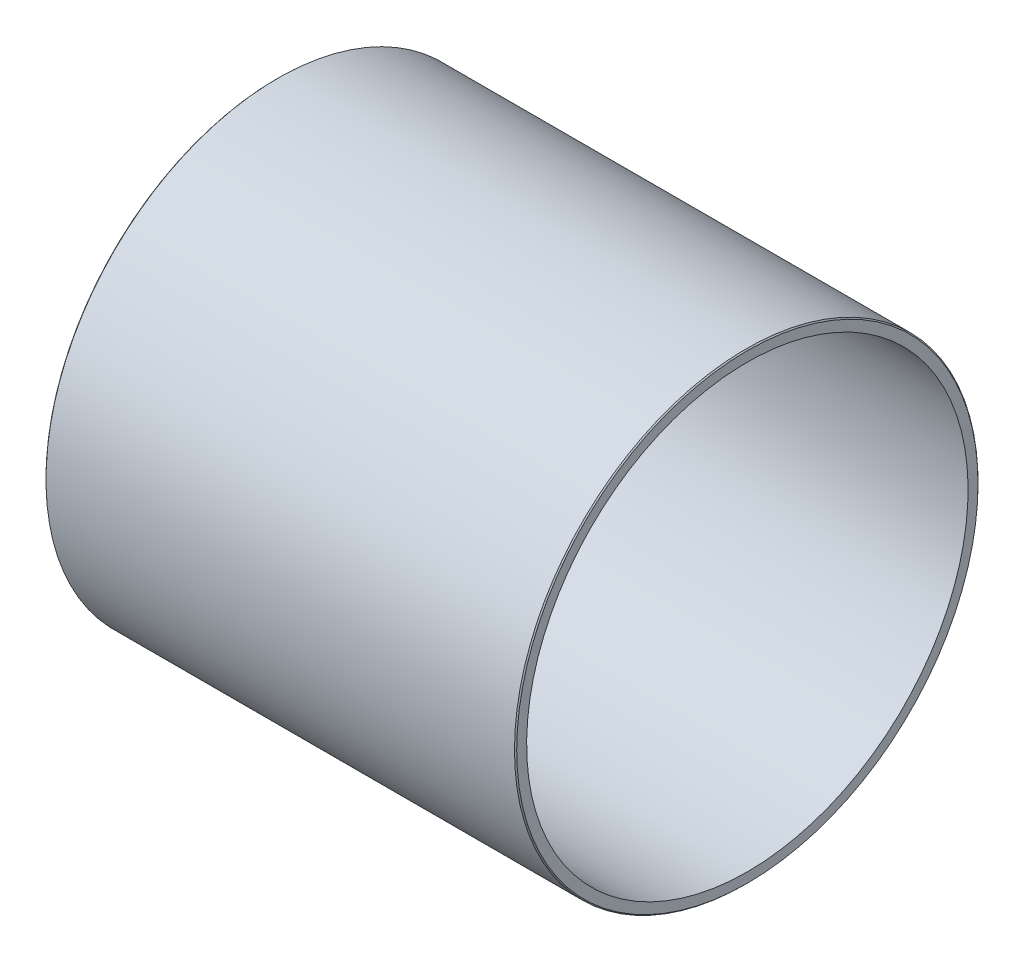
ISO-10303-21;
HEADER;
FILE_DESCRIPTION(('STEP AP214'),'2;1');
FILE_NAME('part.step','',(''),(''),'','','');
FILE_SCHEMA(('AUTOMOTIVE_DESIGN { 1 0 10303 214 1 1 1 1 }'));
ENDSEC;
DATA;
#1=APPLICATION_CONTEXT('core data for automotive mechanical design processes');
#2=APPLICATION_PROTOCOL_DEFINITION('international standard','automotive_design',2000,#1);
#3=PRODUCT_CONTEXT('',#1,'mechanical');
#4=PRODUCT('Part','Part','',(#3));
#5=PRODUCT_RELATED_PRODUCT_CATEGORY('part','',(#4));
#6=PRODUCT_DEFINITION_FORMATION('','',#4);
#7=PRODUCT_DEFINITION_CONTEXT('part definition',#1,'design');
#8=PRODUCT_DEFINITION('design','',#6,#7);
#9=PRODUCT_DEFINITION_SHAPE('','',#8);
#10=(LENGTH_UNIT() NAMED_UNIT(*) SI_UNIT(.MILLI.,.METRE.));
#11=(NAMED_UNIT(*) PLANE_ANGLE_UNIT() SI_UNIT($,.RADIAN.));
#12=(NAMED_UNIT(*) SI_UNIT($,.STERADIAN.) SOLID_ANGLE_UNIT());
#13=UNCERTAINTY_MEASURE_WITH_UNIT(LENGTH_MEASURE(1.E-05),#10,'distance_accuracy_value','');
#14=(GEOMETRIC_REPRESENTATION_CONTEXT(3) GLOBAL_UNCERTAINTY_ASSIGNED_CONTEXT((#13)) GLOBAL_UNIT_ASSIGNED_CONTEXT((#10,
#11,#12)) REPRESENTATION_CONTEXT('',''));
#15=CARTESIAN_POINT('',(0.,0.,0.));
#16=DIRECTION('',(0.,0.,1.));
#17=DIRECTION('',(1.,0.,0.));
#18=AXIS2_PLACEMENT_3D('',#15,#16,#17);
#19=CARTESIAN_POINT('',(9.2,20.5,0.));
#20=DIRECTION('',(-1.,0.,0.));
#21=DIRECTION('',(0.,0.,1.));
#22=AXIS2_PLACEMENT_3D('',#19,#20,#21);
#23=PLANE('',#22);
#24=CARTESIAN_POINT('',(9.2,0.,0.));
#25=DIRECTION('',(1.,0.,0.));
#26=DIRECTION('',(0.,-1.,0.));
#27=AXIS2_PLACEMENT_3D('',#24,#25,#26);
#28=CIRCLE('',#27,20.);
#29=CARTESIAN_POINT('',(9.2,-20.,0.));
#30=VERTEX_POINT('',#29);
#31=EDGE_CURVE('E89',#30,#30,#28,.T.);
#32=ORIENTED_EDGE('',*,*,#31,.T.);
#33=EDGE_LOOP('',(#32));
#34=FACE_BOUND('',#33,.T.);
#35=CARTESIAN_POINT('',(9.2,0.,0.));
#36=DIRECTION('',(-1.,0.,0.));
#37=DIRECTION('',(0.,0.,-1.));
#38=AXIS2_PLACEMENT_3D('',#35,#36,#37);
#39=CIRCLE('',#38,20.9);
#40=CARTESIAN_POINT('',(9.2,0.,-20.9));
#41=VERTEX_POINT('',#40);
#42=EDGE_CURVE('E11',#41,#41,#39,.T.);
#43=ORIENTED_EDGE('',*,*,#42,.T.);
#44=EDGE_LOOP('',(#43));
#45=FACE_BOUND('',#44,.T.);
#46=ADVANCED_FACE('F17',(#34,#45),#23,.T.);
#47=CARTESIAN_POINT('',(9.25,0.,0.));
#48=DIRECTION('',(1.,0.,0.));
#49=DIRECTION('',(0.,0.,1.));
#50=AXIS2_PLACEMENT_3D('',#47,#48,#49);
#51=CONICAL_SURFACE('',#50,20.95,0.785398163397448);
#52=CARTESIAN_POINT('',(9.3,0.,0.));
#53=DIRECTION('',(-1.,0.,0.));
#54=DIRECTION('',(0.,0.,-1.));
#55=AXIS2_PLACEMENT_3D('',#52,#53,#54);
#56=CIRCLE('',#55,21.);
#57=CARTESIAN_POINT('',(9.3,0.,-21.));
#58=VERTEX_POINT('',#57);
#59=CARTESIAN_POINT('',(9.3,-21.,0.));
#60=VERTEX_POINT('',#59);
#61=EDGE_CURVE('E79',#58,#60,#56,.T.);
#62=ORIENTED_EDGE('',*,*,#61,.T.);
#63=CARTESIAN_POINT('',(9.3,0.,0.));
#64=DIRECTION('',(-1.,0.,0.));
#65=DIRECTION('',(0.,0.,-1.));
#66=AXIS2_PLACEMENT_3D('',#63,#64,#65);
#67=CIRCLE('',#66,21.);
#68=EDGE_CURVE('E69',#60,#58,#67,.T.);
#69=ORIENTED_EDGE('',*,*,#68,.T.);
#70=DIRECTION('',(-0.707106781186548,0.,0.707106781186548));
#71=VECTOR('',#70,1.);
#72=CARTESIAN_POINT('',(9.25,0.,-20.95));
#73=LINE('',#72,#71);
#74=EDGE_CURVE('E28',#58,#41,#73,.T.);
#75=ORIENTED_EDGE('',*,*,#74,.T.);
#76=ORIENTED_EDGE('',*,*,#42,.F.);
#77=ORIENTED_EDGE('',*,*,#74,.F.);
#78=EDGE_LOOP('',(#62,#69,#75,#76,#77));
#79=FACE_BOUND('',#78,.T.);
#80=ADVANCED_FACE('F100',(#79),#51,.T.);
#81=CARTESIAN_POINT('',(30.525,0.,0.));
#82=DIRECTION('',(-1.,0.,0.));
#83=DIRECTION('',(0.,1.,0.));
#84=AXIS2_PLACEMENT_3D('',#81,#82,#83);
#85=CYLINDRICAL_SURFACE('',#84,21.);
#86=ORIENTED_EDGE('',*,*,#61,.F.);
#87=ORIENTED_EDGE('',*,*,#68,.F.);
#88=DIRECTION('',(1.,0.,0.));
#89=VECTOR('',#88,1.);
#90=CARTESIAN_POINT('',(30.525,-21.,0.));
#91=LINE('',#90,#89);
#92=CARTESIAN_POINT('',(51.75,-21.,0.));
#93=VERTEX_POINT('',#92);
#94=EDGE_CURVE('E61',#60,#93,#91,.T.);
#95=ORIENTED_EDGE('',*,*,#94,.T.);
#96=CARTESIAN_POINT('',(51.75,0.,0.));
#97=DIRECTION('',(1.,0.,0.));
#98=DIRECTION('',(0.,0.,1.));
#99=AXIS2_PLACEMENT_3D('',#96,#97,#98);
#100=CIRCLE('',#99,21.);
#101=CARTESIAN_POINT('',(51.75,0.,21.));
#102=VERTEX_POINT('',#101);
#103=EDGE_CURVE('E66',#102,#93,#100,.T.);
#104=ORIENTED_EDGE('',*,*,#103,.F.);
#105=CARTESIAN_POINT('',(51.75,0.,0.));
#106=DIRECTION('',(1.,0.,0.));
#107=DIRECTION('',(0.,0.,1.));
#108=AXIS2_PLACEMENT_3D('',#105,#106,#107);
#109=CIRCLE('',#108,21.);
#110=EDGE_CURVE('E76',#93,#102,#109,.T.);
#111=ORIENTED_EDGE('',*,*,#110,.F.);
#112=ORIENTED_EDGE('',*,*,#94,.F.);
#113=EDGE_LOOP('',(#86,#87,#95,#104,#111,#112));
#114=FACE_BOUND('',#113,.T.);
#115=ADVANCED_FACE('F64',(#114),#85,.T.);
#116=CARTESIAN_POINT('',(51.8,0.,0.));
#117=DIRECTION('',(-1.,0.,0.));
#118=DIRECTION('',(0.,0.,-1.));
#119=AXIS2_PLACEMENT_3D('',#116,#117,#118);
#120=CONICAL_SURFACE('',#119,20.95,0.785398163397448);
#121=ORIENTED_EDGE('',*,*,#110,.T.);
#122=DIRECTION('',(0.707106781186548,0.,-0.707106781186548));
#123=VECTOR('',#122,1.);
#124=CARTESIAN_POINT('',(51.8,0.,20.95));
#125=LINE('',#124,#123);
#126=CARTESIAN_POINT('',(51.85,0.,20.9));
#127=VERTEX_POINT('',#126);
#128=EDGE_CURVE('E21',#102,#127,#125,.T.);
#129=ORIENTED_EDGE('',*,*,#128,.T.);
#130=CARTESIAN_POINT('',(51.85,0.,0.));
#131=DIRECTION('',(1.,0.,0.));
#132=DIRECTION('',(0.,0.,-1.));
#133=AXIS2_PLACEMENT_3D('',#130,#131,#132);
#134=CIRCLE('',#133,20.9);
#135=EDGE_CURVE('E81',#127,#127,#134,.T.);
#136=ORIENTED_EDGE('',*,*,#135,.F.);
#137=ORIENTED_EDGE('',*,*,#128,.F.);
#138=ORIENTED_EDGE('',*,*,#103,.T.);
#139=EDGE_LOOP('',(#121,#129,#136,#137,#138));
#140=FACE_BOUND('',#139,.T.);
#141=ADVANCED_FACE('F75',(#140),#120,.T.);
#142=CARTESIAN_POINT('',(51.85,20.5,0.));
#143=DIRECTION('',(1.,0.,0.));
#144=DIRECTION('',(0.,1.,0.));
#145=AXIS2_PLACEMENT_3D('',#142,#143,#144);
#146=PLANE('',#145);
#147=CARTESIAN_POINT('',(51.85,0.,0.));
#148=DIRECTION('',(-1.,0.,0.));
#149=DIRECTION('',(0.,-1.,0.));
#150=AXIS2_PLACEMENT_3D('',#147,#148,#149);
#151=CIRCLE('',#150,20.);
#152=CARTESIAN_POINT('',(51.85,-20.,0.));
#153=VERTEX_POINT('',#152);
#154=EDGE_CURVE('E169',#153,#153,#151,.T.);
#155=ORIENTED_EDGE('',*,*,#154,.T.);
#156=EDGE_LOOP('',(#155));
#157=FACE_BOUND('',#156,.T.);
#158=ORIENTED_EDGE('',*,*,#135,.T.);
#159=EDGE_LOOP('',(#158));
#160=FACE_BOUND('',#159,.T.);
#161=ADVANCED_FACE('F112',(#157,#160),#146,.T.);
#162=CARTESIAN_POINT('',(30.525,0.,0.));
#163=DIRECTION('',(-1.,0.,0.));
#164=DIRECTION('',(0.,1.,0.));
#165=AXIS2_PLACEMENT_3D('',#162,#163,#164);
#166=CYLINDRICAL_SURFACE('',#165,20.);
#167=ORIENTED_EDGE('',*,*,#154,.F.);
#168=DIRECTION('',(-1.,0.,0.));
#169=VECTOR('',#168,1.);
#170=CARTESIAN_POINT('',(30.525,-20.,0.));
#171=LINE('',#170,#169);
#172=EDGE_CURVE('E92',#153,#30,#171,.T.);
#173=ORIENTED_EDGE('',*,*,#172,.T.);
#174=ORIENTED_EDGE('',*,*,#31,.F.);
#175=ORIENTED_EDGE('',*,*,#172,.F.);
#176=EDGE_LOOP('',(#167,#173,#174,#175));
#177=FACE_BOUND('',#176,.T.);
#178=ADVANCED_FACE('F19',(#177),#166,.F.);
#179=CLOSED_SHELL('',(#46,#80,#115,#141,#161,#178));
#180=MANIFOLD_SOLID_BREP('B1',#179);
#181=ADVANCED_BREP_SHAPE_REPRESENTATION('',(#18,#180),#14);
#182=SHAPE_DEFINITION_REPRESENTATION(#9,#181);
ENDSEC;
END-ISO-10303-21;
